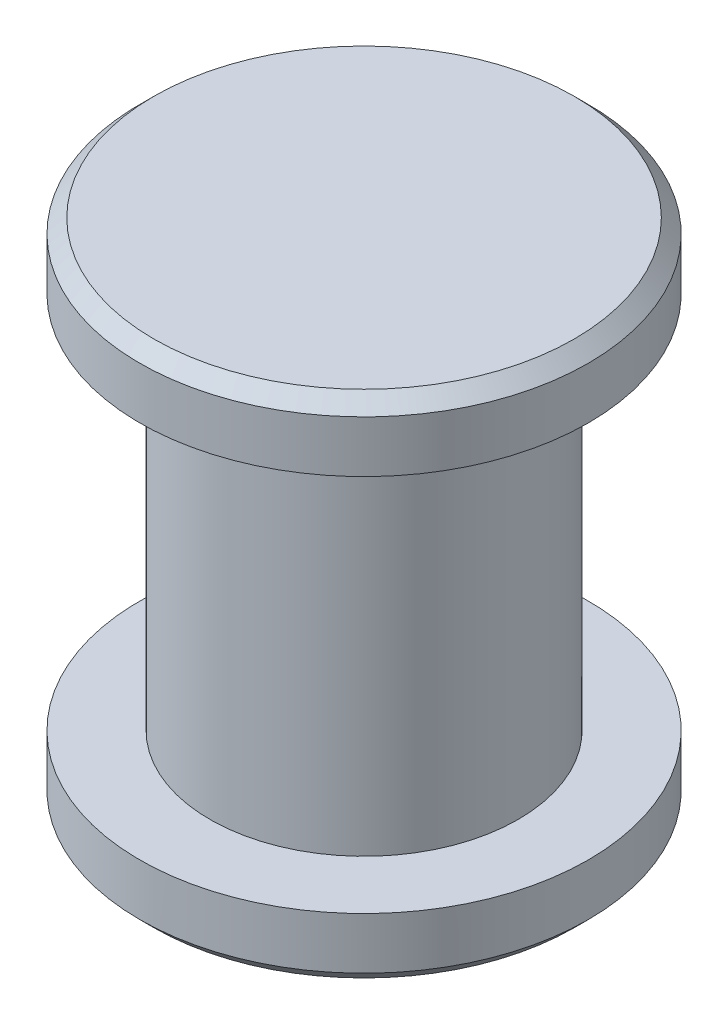
ISO-10303-21;
HEADER;
FILE_DESCRIPTION(('STEP AP214'),'2;1');
FILE_NAME('part.step','',(''),(''),'','','');
FILE_SCHEMA(('AUTOMOTIVE_DESIGN { 1 0 10303 214 1 1 1 1 }'));
ENDSEC;
DATA;
#1=APPLICATION_CONTEXT('core data for automotive mechanical design processes');
#2=APPLICATION_PROTOCOL_DEFINITION('international standard','automotive_design',2000,#1);
#3=PRODUCT_CONTEXT('',#1,'mechanical');
#4=PRODUCT('Part','Part','',(#3));
#5=PRODUCT_RELATED_PRODUCT_CATEGORY('part','',(#4));
#6=PRODUCT_DEFINITION_FORMATION('','',#4);
#7=PRODUCT_DEFINITION_CONTEXT('part definition',#1,'design');
#8=PRODUCT_DEFINITION('design','',#6,#7);
#9=PRODUCT_DEFINITION_SHAPE('','',#8);
#10=(LENGTH_UNIT() NAMED_UNIT(*) SI_UNIT(.MILLI.,.METRE.));
#11=(NAMED_UNIT(*) PLANE_ANGLE_UNIT() SI_UNIT($,.RADIAN.));
#12=(NAMED_UNIT(*) SI_UNIT($,.STERADIAN.) SOLID_ANGLE_UNIT());
#13=UNCERTAINTY_MEASURE_WITH_UNIT(LENGTH_MEASURE(1.E-05),#10,'distance_accuracy_value','');
#14=(GEOMETRIC_REPRESENTATION_CONTEXT(3) GLOBAL_UNCERTAINTY_ASSIGNED_CONTEXT((#13)) GLOBAL_UNIT_ASSIGNED_CONTEXT((#10,
#11,#12)) REPRESENTATION_CONTEXT('',''));
#15=CARTESIAN_POINT('',(0.,0.,0.));
#16=DIRECTION('',(0.,0.,1.));
#17=DIRECTION('',(1.,0.,0.));
#18=AXIS2_PLACEMENT_3D('',#15,#16,#17);
#19=CARTESIAN_POINT('',(0.,9.09486067037462,0.));
#20=DIRECTION('',(0.,-1.,0.));
#21=DIRECTION('',(1.,0.,0.));
#22=AXIS2_PLACEMENT_3D('',#19,#20,#21);
#23=PLANE('',#22);
#24=CARTESIAN_POINT('',(0.,9.09486067037462,0.));
#25=DIRECTION('',(0.,-1.,0.));
#26=DIRECTION('',(1.,0.,0.));
#27=AXIS2_PLACEMENT_3D('',#24,#25,#26);
#28=CIRCLE('',#27,3.75);
#29=CARTESIAN_POINT('',(3.75000000000001,9.09486067037462,0.));
#30=VERTEX_POINT('',#29);
#31=EDGE_CURVE('E10',#30,#30,#28,.F.);
#32=ORIENTED_EDGE('',*,*,#31,.T.);
#33=EDGE_LOOP('',(#32));
#34=FACE_BOUND('',#33,.T.);
#35=ADVANCED_FACE('F35',(#34),#23,.F.);
#36=CARTESIAN_POINT('',(0.,0.,0.));
#37=DIRECTION('',(0.,-1.,0.));
#38=DIRECTION('',(1.,0.,0.));
#39=AXIS2_PLACEMENT_3D('',#36,#37,#38);
#40=CYLINDRICAL_SURFACE('',#39,4.);
#41=CARTESIAN_POINT('',(0.,8.84486067037462,0.));
#42=DIRECTION('',(0.,-1.,0.));
#43=DIRECTION('',(1.,0.,0.));
#44=AXIS2_PLACEMENT_3D('',#41,#42,#43);
#45=CIRCLE('',#44,4.);
#46=CARTESIAN_POINT('',(4.,8.84486067037462,0.));
#47=VERTEX_POINT('',#46);
#48=EDGE_CURVE('E42',#47,#47,#45,.T.);
#49=ORIENTED_EDGE('',*,*,#48,.T.);
#50=EDGE_LOOP('',(#49));
#51=FACE_BOUND('',#50,.T.);
#52=CARTESIAN_POINT('',(0.,7.92243033518731,0.));
#53=DIRECTION('',(0.,-1.,0.));
#54=DIRECTION('',(1.,0.,0.));
#55=AXIS2_PLACEMENT_3D('',#52,#53,#54);
#56=CIRCLE('',#55,4.);
#57=CARTESIAN_POINT('',(4.,7.92243033518731,0.));
#58=VERTEX_POINT('',#57);
#59=EDGE_CURVE('E55',#58,#58,#56,.T.);
#60=ORIENTED_EDGE('',*,*,#59,.F.);
#61=EDGE_LOOP('',(#60));
#62=FACE_BOUND('',#61,.T.);
#63=ADVANCED_FACE('F85',(#51,#62),#40,.T.);
#64=CARTESIAN_POINT('',(-4.,7.92243033518731,0.));
#65=DIRECTION('',(0.,1.,0.));
#66=DIRECTION('',(-1.,0.,0.));
#67=AXIS2_PLACEMENT_3D('',#64,#65,#66);
#68=PLANE('',#67);
#69=CARTESIAN_POINT('',(0.,7.92243033518731,0.));
#70=DIRECTION('',(0.,-1.,0.));
#71=DIRECTION('',(1.,0.,0.));
#72=AXIS2_PLACEMENT_3D('',#69,#70,#71);
#73=CIRCLE('',#72,2.75);
#74=CARTESIAN_POINT('',(2.75,7.92243033518731,0.));
#75=VERTEX_POINT('',#74);
#76=EDGE_CURVE('E58',#75,#75,#73,.T.);
#77=ORIENTED_EDGE('',*,*,#76,.F.);
#78=EDGE_LOOP('',(#77));
#79=FACE_BOUND('',#78,.T.);
#80=ORIENTED_EDGE('',*,*,#59,.T.);
#81=EDGE_LOOP('',(#80));
#82=FACE_BOUND('',#81,.T.);
#83=ADVANCED_FACE('F79',(#79,#82),#68,.F.);
#84=CARTESIAN_POINT('',(0.,0.,0.));
#85=DIRECTION('',(0.,-1.,0.));
#86=DIRECTION('',(1.,0.,0.));
#87=AXIS2_PLACEMENT_3D('',#84,#85,#86);
#88=CYLINDRICAL_SURFACE('',#87,2.75);
#89=CARTESIAN_POINT('',(0.,1.17243033518731,0.));
#90=DIRECTION('',(0.,-1.,0.));
#91=DIRECTION('',(1.,0.,0.));
#92=AXIS2_PLACEMENT_3D('',#89,#90,#91);
#93=CIRCLE('',#92,2.75);
#94=CARTESIAN_POINT('',(2.75,1.17243033518731,0.));
#95=VERTEX_POINT('',#94);
#96=EDGE_CURVE('E61',#95,#95,#93,.T.);
#97=ORIENTED_EDGE('',*,*,#96,.F.);
#98=EDGE_LOOP('',(#97));
#99=FACE_BOUND('',#98,.T.);
#100=ORIENTED_EDGE('',*,*,#76,.T.);
#101=EDGE_LOOP('',(#100));
#102=FACE_BOUND('',#101,.T.);
#103=ADVANCED_FACE('F73',(#99,#102),#88,.T.);
#104=CARTESIAN_POINT('',(-2.75,1.17243033518731,0.));
#105=DIRECTION('',(0.,-1.,0.));
#106=DIRECTION('',(1.,0.,0.));
#107=AXIS2_PLACEMENT_3D('',#104,#105,#106);
#108=PLANE('',#107);
#109=CARTESIAN_POINT('',(0.,1.17243033518731,0.));
#110=DIRECTION('',(0.,-1.,0.));
#111=DIRECTION('',(1.,0.,0.));
#112=AXIS2_PLACEMENT_3D('',#109,#110,#111);
#113=CIRCLE('',#112,4.);
#114=CARTESIAN_POINT('',(4.,1.17243033518731,0.));
#115=VERTEX_POINT('',#114);
#116=EDGE_CURVE('E64',#115,#115,#113,.T.);
#117=ORIENTED_EDGE('',*,*,#116,.F.);
#118=EDGE_LOOP('',(#117));
#119=FACE_BOUND('',#118,.T.);
#120=ORIENTED_EDGE('',*,*,#96,.T.);
#121=EDGE_LOOP('',(#120));
#122=FACE_BOUND('',#121,.T.);
#123=ADVANCED_FACE('F70',(#119,#122),#108,.F.);
#124=CARTESIAN_POINT('',(0.,0.,0.));
#125=DIRECTION('',(0.,-1.,0.));
#126=DIRECTION('',(1.,0.,0.));
#127=AXIS2_PLACEMENT_3D('',#124,#125,#126);
#128=CYLINDRICAL_SURFACE('',#127,4.);
#129=CARTESIAN_POINT('',(0.,0.249999999999997,0.));
#130=DIRECTION('',(0.,1.,0.));
#131=DIRECTION('',(-1.,0.,0.));
#132=AXIS2_PLACEMENT_3D('',#129,#130,#131);
#133=CIRCLE('',#132,4.);
#134=CARTESIAN_POINT('',(-4.,0.249999999999998,0.));
#135=VERTEX_POINT('',#134);
#136=EDGE_CURVE('E46',#135,#135,#133,.T.);
#137=ORIENTED_EDGE('',*,*,#136,.T.);
#138=EDGE_LOOP('',(#137));
#139=FACE_BOUND('',#138,.T.);
#140=ORIENTED_EDGE('',*,*,#116,.T.);
#141=EDGE_LOOP('',(#140));
#142=FACE_BOUND('',#141,.T.);
#143=ADVANCED_FACE('F68',(#139,#142),#128,.T.);
#144=CARTESIAN_POINT('',(-4.00000000000001,0.,0.));
#145=DIRECTION('',(0.,1.,0.));
#146=DIRECTION('',(-1.,0.,0.));
#147=AXIS2_PLACEMENT_3D('',#144,#145,#146);
#148=PLANE('',#147);
#149=CARTESIAN_POINT('',(0.,0.,0.));
#150=DIRECTION('',(0.,1.,0.));
#151=DIRECTION('',(-1.,0.,0.));
#152=AXIS2_PLACEMENT_3D('',#149,#150,#151);
#153=CIRCLE('',#152,3.75000000000001);
#154=CARTESIAN_POINT('',(-3.75000000000001,0.,0.));
#155=VERTEX_POINT('',#154);
#156=EDGE_CURVE('E50',#155,#155,#153,.F.);
#157=ORIENTED_EDGE('',*,*,#156,.T.);
#158=EDGE_LOOP('',(#157));
#159=FACE_BOUND('',#158,.T.);
#160=ADVANCED_FACE('F98',(#159),#148,.F.);
#161=CARTESIAN_POINT('',(0.,0.,0.));
#162=DIRECTION('',(0.,1.,0.));
#163=DIRECTION('',(-1.,0.,0.));
#164=AXIS2_PLACEMENT_3D('',#161,#162,#163);
#165=CONICAL_SURFACE('',#164,3.75000000000001,0.785398163397445);
#166=ORIENTED_EDGE('',*,*,#136,.F.);
#167=EDGE_LOOP('',(#166));
#168=FACE_BOUND('',#167,.T.);
#169=ORIENTED_EDGE('',*,*,#156,.F.);
#170=EDGE_LOOP('',(#169));
#171=FACE_BOUND('',#170,.T.);
#172=ADVANCED_FACE('F96',(#168,#171),#165,.T.);
#173=CARTESIAN_POINT('',(0.,8.84486067037462,0.));
#174=DIRECTION('',(0.,-1.,0.));
#175=DIRECTION('',(1.,0.,0.));
#176=AXIS2_PLACEMENT_3D('',#173,#174,#175);
#177=CONICAL_SURFACE('',#176,4.,0.785398163397447);
#178=ORIENTED_EDGE('',*,*,#31,.F.);
#179=EDGE_LOOP('',(#178));
#180=FACE_BOUND('',#179,.T.);
#181=ORIENTED_EDGE('',*,*,#48,.F.);
#182=EDGE_LOOP('',(#181));
#183=FACE_BOUND('',#182,.T.);
#184=ADVANCED_FACE('F37',(#180,#183),#177,.T.);
#185=CLOSED_SHELL('',(#35,#63,#83,#103,#123,#143,#160,#172,#184));
#186=MANIFOLD_SOLID_BREP('B2',#185);
#187=ADVANCED_BREP_SHAPE_REPRESENTATION('',(#18,#186),#14);
#188=SHAPE_DEFINITION_REPRESENTATION(#9,#187);
ENDSEC;
END-ISO-10303-21;
